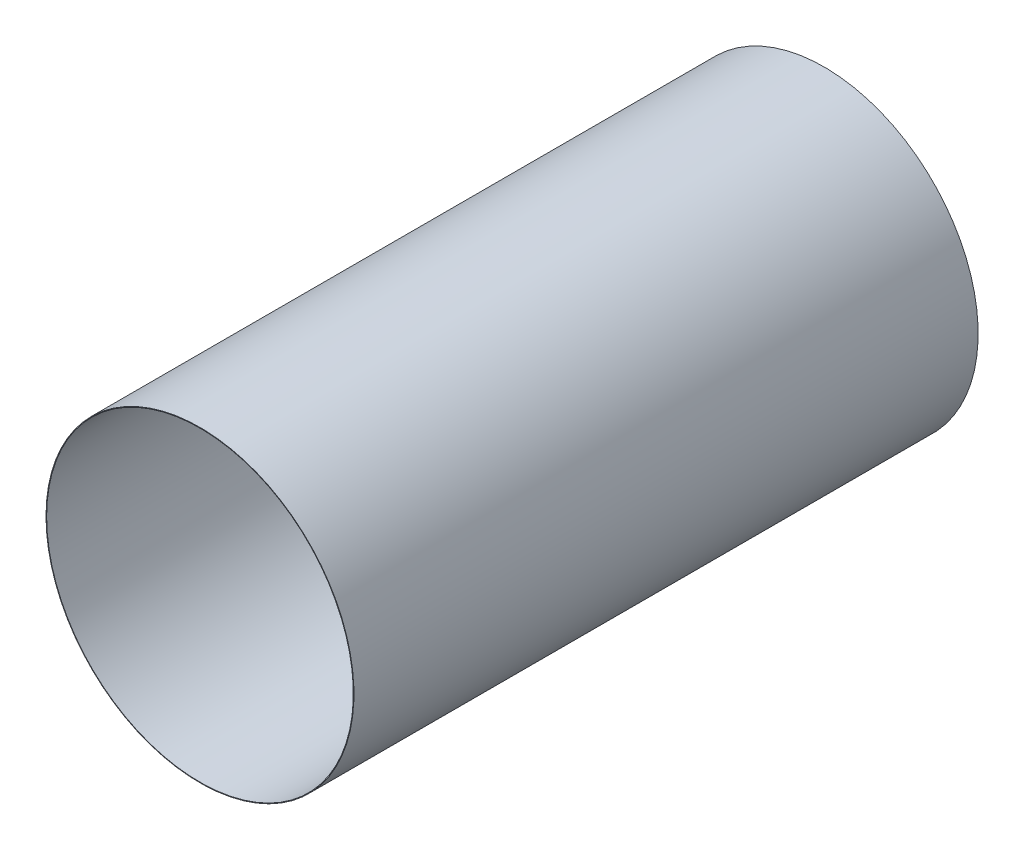
ISO-10303-21;
HEADER;
FILE_DESCRIPTION(('STEP AP214'),'2;1');
FILE_NAME('part.step','',(''),(''),'','','');
FILE_SCHEMA(('AUTOMOTIVE_DESIGN { 1 0 10303 214 1 1 1 1 }'));
ENDSEC;
DATA;
#1=APPLICATION_CONTEXT('core data for automotive mechanical design processes');
#2=APPLICATION_PROTOCOL_DEFINITION('international standard','automotive_design',2000,#1);
#3=PRODUCT_CONTEXT('',#1,'mechanical');
#4=PRODUCT('Part','Part','',(#3));
#5=PRODUCT_RELATED_PRODUCT_CATEGORY('part','',(#4));
#6=PRODUCT_DEFINITION_FORMATION('','',#4);
#7=PRODUCT_DEFINITION_CONTEXT('part definition',#1,'design');
#8=PRODUCT_DEFINITION('design','',#6,#7);
#9=PRODUCT_DEFINITION_SHAPE('','',#8);
#10=(LENGTH_UNIT() NAMED_UNIT(*) SI_UNIT(.MILLI.,.METRE.));
#11=(NAMED_UNIT(*) PLANE_ANGLE_UNIT() SI_UNIT($,.RADIAN.));
#12=(NAMED_UNIT(*) SI_UNIT($,.STERADIAN.) SOLID_ANGLE_UNIT());
#13=UNCERTAINTY_MEASURE_WITH_UNIT(LENGTH_MEASURE(1.E-05),#10,'distance_accuracy_value','');
#14=(GEOMETRIC_REPRESENTATION_CONTEXT(3) GLOBAL_UNCERTAINTY_ASSIGNED_CONTEXT((#13)) GLOBAL_UNIT_ASSIGNED_CONTEXT((#10,
#11,#12)) REPRESENTATION_CONTEXT('',''));
#15=CARTESIAN_POINT('',(0.,0.,0.));
#16=DIRECTION('',(0.,0.,1.));
#17=DIRECTION('',(1.,0.,0.));
#18=AXIS2_PLACEMENT_3D('',#15,#16,#17);
#19=CARTESIAN_POINT('',(0.,0.,208.));
#20=DIRECTION('',(0.,0.,1.));
#21=DIRECTION('',(1.,0.,0.));
#22=AXIS2_PLACEMENT_3D('',#19,#20,#21);
#23=PLANE('',#22);
#24=CARTESIAN_POINT('',(0.,0.,208.));
#25=DIRECTION('',(0.,0.,1.));
#26=DIRECTION('',(1.,0.,0.));
#27=AXIS2_PLACEMENT_3D('',#24,#25,#26);
#28=CIRCLE('',#27,51.3);
#29=CARTESIAN_POINT('',(-51.3,0.,208.));
#30=VERTEX_POINT('',#29);
#31=EDGE_CURVE('E10',#30,#30,#28,.T.);
#32=ORIENTED_EDGE('',*,*,#31,.T.);
#33=EDGE_LOOP('',(#32));
#34=FACE_BOUND('',#33,.T.);
#35=CARTESIAN_POINT('',(0.,0.,208.));
#36=DIRECTION('',(0.,0.,1.));
#37=DIRECTION('',(1.,0.,0.));
#38=AXIS2_PLACEMENT_3D('',#35,#36,#37);
#39=CIRCLE('',#38,51.1);
#40=CARTESIAN_POINT('',(-51.1,0.,208.));
#41=VERTEX_POINT('',#40);
#42=EDGE_CURVE('E48',#41,#41,#39,.T.);
#43=ORIENTED_EDGE('',*,*,#42,.F.);
#44=EDGE_LOOP('',(#43));
#45=FACE_BOUND('',#44,.T.);
#46=ADVANCED_FACE('F37',(#34,#45),#23,.T.);
#47=CARTESIAN_POINT('',(0.,0.,0.));
#48=DIRECTION('',(0.,0.,1.));
#49=DIRECTION('',(1.,0.,0.));
#50=AXIS2_PLACEMENT_3D('',#47,#48,#49);
#51=PLANE('',#50);
#52=CARTESIAN_POINT('',(0.,0.,0.));
#53=DIRECTION('',(0.,0.,1.));
#54=DIRECTION('',(1.,0.,0.));
#55=AXIS2_PLACEMENT_3D('',#52,#53,#54);
#56=CIRCLE('',#55,51.3);
#57=CARTESIAN_POINT('',(-51.3,0.,0.));
#58=VERTEX_POINT('',#57);
#59=EDGE_CURVE('E41',#58,#58,#56,.T.);
#60=ORIENTED_EDGE('',*,*,#59,.F.);
#61=EDGE_LOOP('',(#60));
#62=FACE_BOUND('',#61,.T.);
#63=CARTESIAN_POINT('',(0.,0.,0.));
#64=DIRECTION('',(0.,0.,1.));
#65=DIRECTION('',(1.,0.,0.));
#66=AXIS2_PLACEMENT_3D('',#63,#64,#65);
#67=CIRCLE('',#66,51.1);
#68=CARTESIAN_POINT('',(-51.1,0.,0.));
#69=VERTEX_POINT('',#68);
#70=EDGE_CURVE('E50',#69,#69,#67,.T.);
#71=ORIENTED_EDGE('',*,*,#70,.T.);
#72=EDGE_LOOP('',(#71));
#73=FACE_BOUND('',#72,.T.);
#74=ADVANCED_FACE('F60',(#62,#73),#51,.F.);
#75=CARTESIAN_POINT('',(0.,0.,208.));
#76=DIRECTION('',(0.,0.,-1.));
#77=DIRECTION('',(-1.,0.,0.));
#78=AXIS2_PLACEMENT_3D('',#75,#76,#77);
#79=CYLINDRICAL_SURFACE('',#78,51.3);
#80=CARTESIAN_POINT('',(-51.3,0.,208.));
#81=CARTESIAN_POINT('',(-51.3,0.,205.833333333333));
#82=CARTESIAN_POINT('',(-51.3,0.,203.666666666667));
#83=CARTESIAN_POINT('',(-51.3,0.,199.333333333333));
#84=CARTESIAN_POINT('',(-51.3,0.,197.166666666667));
#85=CARTESIAN_POINT('',(-51.3,0.,192.833333333333));
#86=CARTESIAN_POINT('',(-51.3,0.,190.666666666667));
#87=CARTESIAN_POINT('',(-51.3,0.,186.333333333333));
#88=CARTESIAN_POINT('',(-51.3,0.,184.166666666667));
#89=CARTESIAN_POINT('',(-51.3,0.,179.833333333333));
#90=CARTESIAN_POINT('',(-51.3,0.,177.666666666667));
#91=CARTESIAN_POINT('',(-51.3,0.,173.333333333333));
#92=CARTESIAN_POINT('',(-51.3,0.,171.166666666667));
#93=CARTESIAN_POINT('',(-51.3,0.,166.833333333333));
#94=CARTESIAN_POINT('',(-51.3,0.,164.666666666667));
#95=CARTESIAN_POINT('',(-51.3,0.,160.333333333333));
#96=CARTESIAN_POINT('',(-51.3,0.,158.166666666667));
#97=CARTESIAN_POINT('',(-51.3,0.,153.833333333333));
#98=CARTESIAN_POINT('',(-51.3,0.,151.666666666667));
#99=CARTESIAN_POINT('',(-51.3,0.,147.333333333333));
#100=CARTESIAN_POINT('',(-51.3,0.,145.166666666667));
#101=CARTESIAN_POINT('',(-51.3,0.,140.833333333333));
#102=CARTESIAN_POINT('',(-51.3,0.,138.666666666667));
#103=CARTESIAN_POINT('',(-51.3,0.,134.333333333333));
#104=CARTESIAN_POINT('',(-51.3,0.,132.166666666667));
#105=CARTESIAN_POINT('',(-51.3,0.,127.833333333333));
#106=CARTESIAN_POINT('',(-51.3,0.,125.666666666667));
#107=CARTESIAN_POINT('',(-51.3,0.,121.333333333333));
#108=CARTESIAN_POINT('',(-51.3,0.,119.166666666667));
#109=CARTESIAN_POINT('',(-51.3,0.,114.833333333333));
#110=CARTESIAN_POINT('',(-51.3,0.,112.666666666667));
#111=CARTESIAN_POINT('',(-51.3,0.,108.333333333333));
#112=CARTESIAN_POINT('',(-51.3,0.,106.166666666667));
#113=CARTESIAN_POINT('',(-51.3,0.,101.833333333333));
#114=CARTESIAN_POINT('',(-51.3,0.,99.6666666666666));
#115=CARTESIAN_POINT('',(-51.3,0.,95.3333333333333));
#116=CARTESIAN_POINT('',(-51.3,0.,93.1666666666666));
#117=CARTESIAN_POINT('',(-51.3,0.,88.8333333333333));
#118=CARTESIAN_POINT('',(-51.3,0.,86.6666666666666));
#119=CARTESIAN_POINT('',(-51.3,0.,82.3333333333333));
#120=CARTESIAN_POINT('',(-51.3,0.,80.1666666666667));
#121=CARTESIAN_POINT('',(-51.3,0.,75.8333333333333));
#122=CARTESIAN_POINT('',(-51.3,0.,73.6666666666667));
#123=CARTESIAN_POINT('',(-51.3,0.,69.3333333333333));
#124=CARTESIAN_POINT('',(-51.3,0.,67.1666666666667));
#125=CARTESIAN_POINT('',(-51.3,0.,62.8333333333333));
#126=CARTESIAN_POINT('',(-51.3,0.,60.6666666666667));
#127=CARTESIAN_POINT('',(-51.3,0.,56.3333333333333));
#128=CARTESIAN_POINT('',(-51.3,0.,54.1666666666667));
#129=CARTESIAN_POINT('',(-51.3,0.,49.8333333333333));
#130=CARTESIAN_POINT('',(-51.3,0.,47.6666666666667));
#131=CARTESIAN_POINT('',(-51.3,0.,43.3333333333333));
#132=CARTESIAN_POINT('',(-51.3,0.,41.1666666666667));
#133=CARTESIAN_POINT('',(-51.3,0.,36.8333333333333));
#134=CARTESIAN_POINT('',(-51.3,0.,34.6666666666667));
#135=CARTESIAN_POINT('',(-51.3,0.,30.3333333333333));
#136=CARTESIAN_POINT('',(-51.3,0.,28.1666666666667));
#137=CARTESIAN_POINT('',(-51.3,0.,23.8333333333333));
#138=CARTESIAN_POINT('',(-51.3,0.,21.6666666666667));
#139=CARTESIAN_POINT('',(-51.3,0.,17.3333333333333));
#140=CARTESIAN_POINT('',(-51.3,0.,15.1666666666667));
#141=CARTESIAN_POINT('',(-51.3,0.,10.8333333333333));
#142=CARTESIAN_POINT('',(-51.3,0.,8.66666666666667));
#143=CARTESIAN_POINT('',(-51.3,0.,4.33333333333334));
#144=CARTESIAN_POINT('',(-51.3,0.,2.16666666666667));
#145=CARTESIAN_POINT('',(-51.3,0.,0.));
#146=B_SPLINE_CURVE_WITH_KNOTS('',3,(#80,#81,#82,#83,#84,#85,#86,#87,#88,#89,#90,#91,#92,#93,
#94,#95,#96,#97,#98,#99,#100,#101,#102,#103,#104,#105,#106,#107,#108,#109,#110,#111,#112,#113,
#114,#115,#116,#117,#118,#119,#120,#121,#122,#123,#124,#125,#126,#127,#128,#129,#130,#131,#132,
#133,#134,#135,#136,#137,#138,#139,#140,#141,#142,#143,#144,#145),.UNSPECIFIED.,.F.,.F.,(4,2,2,
2,2,2,2,2,2,2,2,2,2,2,2,2,2,2,2,2,2,2,2,2,2,2,2,2,2,2,2,2,4),(0.,6.50000000000001,13.,19.5,26.,
32.5,39.,45.5,52.,58.5,65.,71.5,78.,84.5,91.,97.5,104.,110.5,117.,123.5,130.,136.5,143.,149.5,
156.,162.5,169.,175.5,182.,188.5,195.,201.5,208.),.UNSPECIFIED.);
#147=EDGE_CURVE('BSEAM39',#30,#58,#146,.T.);
#148=ORIENTED_EDGE('',*,*,#31,.F.);
#149=ORIENTED_EDGE('',*,*,#59,.T.);
#150=ORIENTED_EDGE('',*,*,#147,.T.);
#151=ORIENTED_EDGE('',*,*,#147,.F.);
#152=EDGE_LOOP('',(#148,#150,#149,#151));
#153=FACE_BOUND('',#152,.T.);
#154=ADVANCED_FACE('F39',(#153),#79,.T.);
#155=CARTESIAN_POINT('',(0.,0.,208.));
#156=DIRECTION('',(0.,0.,-1.));
#157=DIRECTION('',(-1.,0.,0.));
#158=AXIS2_PLACEMENT_3D('',#155,#156,#157);
#159=CYLINDRICAL_SURFACE('',#158,51.1);
#160=CARTESIAN_POINT('',(-51.1,0.,208.));
#161=CARTESIAN_POINT('',(-51.1,0.,205.833333333333));
#162=CARTESIAN_POINT('',(-51.1,0.,203.666666666667));
#163=CARTESIAN_POINT('',(-51.1,0.,199.333333333333));
#164=CARTESIAN_POINT('',(-51.1,0.,197.166666666667));
#165=CARTESIAN_POINT('',(-51.1,0.,192.833333333333));
#166=CARTESIAN_POINT('',(-51.1,0.,190.666666666667));
#167=CARTESIAN_POINT('',(-51.1,0.,186.333333333333));
#168=CARTESIAN_POINT('',(-51.1,0.,184.166666666667));
#169=CARTESIAN_POINT('',(-51.1,0.,179.833333333333));
#170=CARTESIAN_POINT('',(-51.1,0.,177.666666666667));
#171=CARTESIAN_POINT('',(-51.1,0.,173.333333333333));
#172=CARTESIAN_POINT('',(-51.1,0.,171.166666666667));
#173=CARTESIAN_POINT('',(-51.1,0.,166.833333333333));
#174=CARTESIAN_POINT('',(-51.1,0.,164.666666666667));
#175=CARTESIAN_POINT('',(-51.1,0.,160.333333333333));
#176=CARTESIAN_POINT('',(-51.1,0.,158.166666666667));
#177=CARTESIAN_POINT('',(-51.1,0.,153.833333333333));
#178=CARTESIAN_POINT('',(-51.1,0.,151.666666666667));
#179=CARTESIAN_POINT('',(-51.1,0.,147.333333333333));
#180=CARTESIAN_POINT('',(-51.1,0.,145.166666666667));
#181=CARTESIAN_POINT('',(-51.1,0.,140.833333333333));
#182=CARTESIAN_POINT('',(-51.1,0.,138.666666666667));
#183=CARTESIAN_POINT('',(-51.1,0.,134.333333333333));
#184=CARTESIAN_POINT('',(-51.1,0.,132.166666666667));
#185=CARTESIAN_POINT('',(-51.1,0.,127.833333333333));
#186=CARTESIAN_POINT('',(-51.1,0.,125.666666666667));
#187=CARTESIAN_POINT('',(-51.1,0.,121.333333333333));
#188=CARTESIAN_POINT('',(-51.1,0.,119.166666666667));
#189=CARTESIAN_POINT('',(-51.1,0.,114.833333333333));
#190=CARTESIAN_POINT('',(-51.1,0.,112.666666666667));
#191=CARTESIAN_POINT('',(-51.1,0.,108.333333333333));
#192=CARTESIAN_POINT('',(-51.1,0.,106.166666666667));
#193=CARTESIAN_POINT('',(-51.1,0.,101.833333333333));
#194=CARTESIAN_POINT('',(-51.1,0.,99.6666666666666));
#195=CARTESIAN_POINT('',(-51.1,0.,95.3333333333333));
#196=CARTESIAN_POINT('',(-51.1,0.,93.1666666666666));
#197=CARTESIAN_POINT('',(-51.1,0.,88.8333333333333));
#198=CARTESIAN_POINT('',(-51.1,0.,86.6666666666666));
#199=CARTESIAN_POINT('',(-51.1,0.,82.3333333333333));
#200=CARTESIAN_POINT('',(-51.1,0.,80.1666666666667));
#201=CARTESIAN_POINT('',(-51.1,0.,75.8333333333333));
#202=CARTESIAN_POINT('',(-51.1,0.,73.6666666666667));
#203=CARTESIAN_POINT('',(-51.1,0.,69.3333333333333));
#204=CARTESIAN_POINT('',(-51.1,0.,67.1666666666667));
#205=CARTESIAN_POINT('',(-51.1,0.,62.8333333333333));
#206=CARTESIAN_POINT('',(-51.1,0.,60.6666666666667));
#207=CARTESIAN_POINT('',(-51.1,0.,56.3333333333333));
#208=CARTESIAN_POINT('',(-51.1,0.,54.1666666666667));
#209=CARTESIAN_POINT('',(-51.1,0.,49.8333333333333));
#210=CARTESIAN_POINT('',(-51.1,0.,47.6666666666667));
#211=CARTESIAN_POINT('',(-51.1,0.,43.3333333333333));
#212=CARTESIAN_POINT('',(-51.1,0.,41.1666666666667));
#213=CARTESIAN_POINT('',(-51.1,0.,36.8333333333333));
#214=CARTESIAN_POINT('',(-51.1,0.,34.6666666666667));
#215=CARTESIAN_POINT('',(-51.1,0.,30.3333333333333));
#216=CARTESIAN_POINT('',(-51.1,0.,28.1666666666667));
#217=CARTESIAN_POINT('',(-51.1,0.,23.8333333333333));
#218=CARTESIAN_POINT('',(-51.1,0.,21.6666666666667));
#219=CARTESIAN_POINT('',(-51.1,0.,17.3333333333333));
#220=CARTESIAN_POINT('',(-51.1,0.,15.1666666666667));
#221=CARTESIAN_POINT('',(-51.1,0.,10.8333333333333));
#222=CARTESIAN_POINT('',(-51.1,0.,8.66666666666667));
#223=CARTESIAN_POINT('',(-51.1,0.,4.33333333333334));
#224=CARTESIAN_POINT('',(-51.1,0.,2.16666666666667));
#225=CARTESIAN_POINT('',(-51.1,0.,0.));
#226=B_SPLINE_CURVE_WITH_KNOTS('',3,(#160,#161,#162,#163,#164,#165,#166,#167,#168,#169,#170,
#171,#172,#173,#174,#175,#176,#177,#178,#179,#180,#181,#182,#183,#184,#185,#186,#187,#188,#189,
#190,#191,#192,#193,#194,#195,#196,#197,#198,#199,#200,#201,#202,#203,#204,#205,#206,#207,#208,
#209,#210,#211,#212,#213,#214,#215,#216,#217,#218,#219,#220,#221,#222,#223,#224,#225),
.UNSPECIFIED.,.F.,.F.,(4,2,2,2,2,2,2,2,2,2,2,2,2,2,2,2,2,2,2,2,2,2,2,2,2,2,2,2,2,2,2,2,4),(0.,
6.50000000000001,13.,19.5,26.,32.5,39.,45.5,52.,58.5,65.,71.5,78.,84.5,91.,97.5,104.,110.5,117.,
123.5,130.,136.5,143.,149.5,156.,162.5,169.,175.5,182.,188.5,195.,201.5,208.),.UNSPECIFIED.);
#227=EDGE_CURVE('BSEAM56',#41,#69,#226,.T.);
#228=ORIENTED_EDGE('',*,*,#42,.T.);
#229=ORIENTED_EDGE('',*,*,#70,.F.);
#230=ORIENTED_EDGE('',*,*,#227,.T.);
#231=ORIENTED_EDGE('',*,*,#227,.F.);
#232=EDGE_LOOP('',(#228,#230,#229,#231));
#233=FACE_BOUND('',#232,.T.);
#234=ADVANCED_FACE('F56',(#233),#159,.F.);
#235=CLOSED_SHELL('',(#46,#74,#154,#234));
#236=MANIFOLD_SOLID_BREP('B2',#235);
#237=ADVANCED_BREP_SHAPE_REPRESENTATION('',(#18,#236),#14);
#238=SHAPE_DEFINITION_REPRESENTATION(#9,#237);
ENDSEC;
END-ISO-10303-21;
